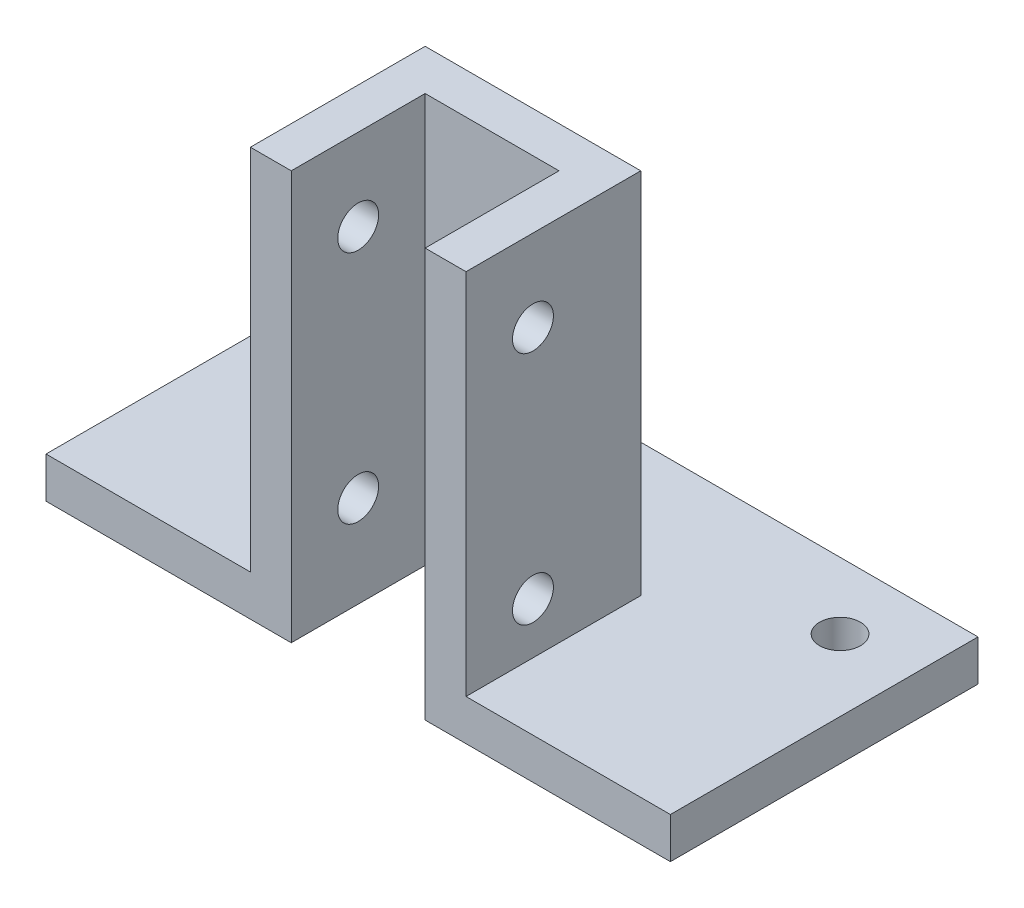
ISO-10303-21;
HEADER;
FILE_DESCRIPTION(('STEP AP214'),'2;1');
FILE_NAME('part.step','',(''),(''),'','','');
FILE_SCHEMA(('AUTOMOTIVE_DESIGN { 1 0 10303 214 1 1 1 1 }'));
ENDSEC;
DATA;
#1=APPLICATION_CONTEXT('core data for automotive mechanical design processes');
#2=APPLICATION_PROTOCOL_DEFINITION('international standard','automotive_design',2000,#1);
#3=PRODUCT_CONTEXT('',#1,'mechanical');
#4=PRODUCT('Part','Part','',(#3));
#5=PRODUCT_RELATED_PRODUCT_CATEGORY('part','',(#4));
#6=PRODUCT_DEFINITION_FORMATION('','',#4);
#7=PRODUCT_DEFINITION_CONTEXT('part definition',#1,'design');
#8=PRODUCT_DEFINITION('design','',#6,#7);
#9=PRODUCT_DEFINITION_SHAPE('','',#8);
#10=(LENGTH_UNIT() NAMED_UNIT(*) SI_UNIT(.MILLI.,.METRE.));
#11=(NAMED_UNIT(*) PLANE_ANGLE_UNIT() SI_UNIT($,.RADIAN.));
#12=(NAMED_UNIT(*) SI_UNIT($,.STERADIAN.) SOLID_ANGLE_UNIT());
#13=UNCERTAINTY_MEASURE_WITH_UNIT(LENGTH_MEASURE(1.E-05),#10,'distance_accuracy_value','');
#14=(GEOMETRIC_REPRESENTATION_CONTEXT(3) GLOBAL_UNCERTAINTY_ASSIGNED_CONTEXT((#13)) GLOBAL_UNIT_ASSIGNED_CONTEXT((#10,
#11,#12)) REPRESENTATION_CONTEXT('',''));
#15=CARTESIAN_POINT('',(0.,0.,0.));
#16=DIRECTION('',(0.,0.,1.));
#17=DIRECTION('',(1.,0.,0.));
#18=AXIS2_PLACEMENT_3D('',#15,#16,#17);
#19=CARTESIAN_POINT('',(0.,40.,-2.));
#20=DIRECTION('',(0.,0.,1.));
#21=DIRECTION('',(1.,0.,0.));
#22=AXIS2_PLACEMENT_3D('',#19,#20,#21);
#23=PLANE('',#22);
#24=DIRECTION('',(1.,0.,0.));
#25=VECTOR('',#24,1.);
#26=CARTESIAN_POINT('',(0.,4.,-2.));
#27=LINE('',#26,#25);
#28=CARTESIAN_POINT('',(-10.55,4.,-2.));
#29=VERTEX_POINT('',#28);
#30=CARTESIAN_POINT('',(10.55,4.,-2.));
#31=VERTEX_POINT('',#30);
#32=EDGE_CURVE('E196',#29,#31,#27,.T.);
#33=ORIENTED_EDGE('',*,*,#32,.F.);
#34=DIRECTION('',(0.,-1.,0.));
#35=VECTOR('',#34,1.);
#36=CARTESIAN_POINT('',(-10.55,40.,-2.));
#37=LINE('',#36,#35);
#38=CARTESIAN_POINT('',(-10.55,40.,-2.));
#39=VERTEX_POINT('',#38);
#40=EDGE_CURVE('E11',#39,#29,#37,.T.);
#41=ORIENTED_EDGE('',*,*,#40,.F.);
#42=DIRECTION('',(-1.,0.,0.));
#43=VECTOR('',#42,1.);
#44=CARTESIAN_POINT('',(0.,40.,-2.));
#45=LINE('',#44,#43);
#46=CARTESIAN_POINT('',(10.55,40.,-2.));
#47=VERTEX_POINT('',#46);
#48=EDGE_CURVE('E139',#47,#39,#45,.T.);
#49=ORIENTED_EDGE('',*,*,#48,.F.);
#50=DIRECTION('',(0.,-1.,0.));
#51=VECTOR('',#50,1.);
#52=CARTESIAN_POINT('',(10.55,40.,-2.));
#53=LINE('',#52,#51);
#54=EDGE_CURVE('E51',#47,#31,#53,.T.);
#55=ORIENTED_EDGE('',*,*,#54,.T.);
#56=EDGE_LOOP('',(#33,#41,#49,#55));
#57=FACE_BOUND('',#56,.T.);
#58=ADVANCED_FACE('F33',(#57),#23,.F.);
#59=CARTESIAN_POINT('',(-10.55,40.,0.));
#60=DIRECTION('',(1.,0.,0.));
#61=DIRECTION('',(0.,0.,-1.));
#62=AXIS2_PLACEMENT_3D('',#59,#60,#61);
#63=PLANE('',#62);
#64=CARTESIAN_POINT('',(-10.55,32.,8.55));
#65=DIRECTION('',(-1.,0.,0.));
#66=DIRECTION('',(0.,0.,1.));
#67=AXIS2_PLACEMENT_3D('',#64,#65,#66);
#68=CIRCLE('',#67,2.);
#69=CARTESIAN_POINT('',(-10.55,32.,10.55));
#70=VERTEX_POINT('',#69);
#71=EDGE_CURVE('E151',#70,#70,#68,.T.);
#72=ORIENTED_EDGE('',*,*,#71,.F.);
#73=EDGE_LOOP('',(#72));
#74=FACE_BOUND('',#73,.T.);
#75=CARTESIAN_POINT('',(-10.55,9.,8.55));
#76=DIRECTION('',(-1.,0.,0.));
#77=DIRECTION('',(0.,0.,1.));
#78=AXIS2_PLACEMENT_3D('',#75,#76,#77);
#79=CIRCLE('',#78,2.);
#80=CARTESIAN_POINT('',(-10.55,9.,10.55));
#81=VERTEX_POINT('',#80);
#82=EDGE_CURVE('E158',#81,#81,#79,.T.);
#83=ORIENTED_EDGE('',*,*,#82,.F.);
#84=EDGE_LOOP('',(#83));
#85=FACE_BOUND('',#84,.T.);
#86=DIRECTION('',(0.,0.,-1.));
#87=VECTOR('',#86,1.);
#88=CARTESIAN_POINT('',(-10.55,4.,0.));
#89=LINE('',#88,#87);
#90=CARTESIAN_POINT('',(-10.55,4.,15.1));
#91=VERTEX_POINT('',#90);
#92=EDGE_CURVE('E199',#91,#29,#89,.T.);
#93=ORIENTED_EDGE('',*,*,#92,.F.);
#94=DIRECTION('',(0.,-1.,0.));
#95=VECTOR('',#94,1.);
#96=CARTESIAN_POINT('',(-10.55,40.,15.1));
#97=LINE('',#96,#95);
#98=CARTESIAN_POINT('',(-10.55,40.,15.1));
#99=VERTEX_POINT('',#98);
#100=EDGE_CURVE('E42',#99,#91,#97,.T.);
#101=ORIENTED_EDGE('',*,*,#100,.F.);
#102=DIRECTION('',(0.,0.,1.));
#103=VECTOR('',#102,1.);
#104=CARTESIAN_POINT('',(-10.55,40.,0.));
#105=LINE('',#104,#103);
#106=EDGE_CURVE('E86',#39,#99,#105,.T.);
#107=ORIENTED_EDGE('',*,*,#106,.F.);
#108=ORIENTED_EDGE('',*,*,#40,.T.);
#109=EDGE_LOOP('',(#93,#101,#107,#108));
#110=FACE_BOUND('',#109,.T.);
#111=ADVANCED_FACE('F261',(#74,#85,#110),#63,.F.);
#112=CARTESIAN_POINT('',(10.55,40.,0.));
#113=DIRECTION('',(1.,0.,0.));
#114=DIRECTION('',(0.,0.,-1.));
#115=AXIS2_PLACEMENT_3D('',#112,#113,#114);
#116=PLANE('',#115);
#117=CARTESIAN_POINT('',(10.55,32.,8.55));
#118=DIRECTION('',(1.,0.,0.));
#119=DIRECTION('',(0.,0.,-1.));
#120=AXIS2_PLACEMENT_3D('',#117,#118,#119);
#121=CIRCLE('',#120,2.);
#122=CARTESIAN_POINT('',(10.55,32.,6.55));
#123=VERTEX_POINT('',#122);
#124=EDGE_CURVE('E170',#123,#123,#121,.T.);
#125=ORIENTED_EDGE('',*,*,#124,.F.);
#126=EDGE_LOOP('',(#125));
#127=FACE_BOUND('',#126,.T.);
#128=CARTESIAN_POINT('',(10.55,9.,8.55));
#129=DIRECTION('',(1.,0.,0.));
#130=DIRECTION('',(0.,0.,-1.));
#131=AXIS2_PLACEMENT_3D('',#128,#129,#130);
#132=CIRCLE('',#131,2.);
#133=CARTESIAN_POINT('',(10.55,9.,6.55));
#134=VERTEX_POINT('',#133);
#135=EDGE_CURVE('E155',#134,#134,#132,.T.);
#136=ORIENTED_EDGE('',*,*,#135,.F.);
#137=EDGE_LOOP('',(#136));
#138=FACE_BOUND('',#137,.T.);
#139=DIRECTION('',(0.,-1.,0.));
#140=VECTOR('',#139,1.);
#141=CARTESIAN_POINT('',(10.55,40.,15.1));
#142=LINE('',#141,#140);
#143=CARTESIAN_POINT('',(10.55,40.,15.1));
#144=VERTEX_POINT('',#143);
#145=CARTESIAN_POINT('',(10.55,4.,15.1));
#146=VERTEX_POINT('',#145);
#147=EDGE_CURVE('E106',#144,#146,#142,.T.);
#148=ORIENTED_EDGE('',*,*,#147,.T.);
#149=DIRECTION('',(0.,0.,1.));
#150=VECTOR('',#149,1.);
#151=CARTESIAN_POINT('',(10.55,4.,0.));
#152=LINE('',#151,#150);
#153=EDGE_CURVE('E193',#31,#146,#152,.T.);
#154=ORIENTED_EDGE('',*,*,#153,.F.);
#155=ORIENTED_EDGE('',*,*,#54,.F.);
#156=DIRECTION('',(0.,0.,1.));
#157=VECTOR('',#156,1.);
#158=CARTESIAN_POINT('',(10.55,40.,0.));
#159=LINE('',#158,#157);
#160=EDGE_CURVE('E115',#47,#144,#159,.T.);
#161=ORIENTED_EDGE('',*,*,#160,.T.);
#162=EDGE_LOOP('',(#148,#154,#155,#161));
#163=FACE_BOUND('',#162,.T.);
#164=ADVANCED_FACE('F266',(#127,#138,#163),#116,.T.);
#165=CARTESIAN_POINT('',(0.,40.,15.1));
#166=DIRECTION('',(0.,0.,1.));
#167=DIRECTION('',(1.,0.,0.));
#168=AXIS2_PLACEMENT_3D('',#165,#166,#167);
#169=PLANE('',#168);
#170=DIRECTION('',(-1.,0.,0.));
#171=VECTOR('',#170,1.);
#172=CARTESIAN_POINT('',(0.,0.,15.1));
#173=LINE('',#172,#171);
#174=CARTESIAN_POINT('',(-6.55,0.,15.1));
#175=VERTEX_POINT('',#174);
#176=CARTESIAN_POINT('',(-30.55,0.,15.1));
#177=VERTEX_POINT('',#176);
#178=EDGE_CURVE('E127',#175,#177,#173,.T.);
#179=ORIENTED_EDGE('',*,*,#178,.F.);
#180=DIRECTION('',(0.,-1.,0.));
#181=VECTOR('',#180,1.);
#182=CARTESIAN_POINT('',(-6.55,40.,15.1));
#183=LINE('',#182,#181);
#184=CARTESIAN_POINT('',(-6.55,40.,15.1));
#185=VERTEX_POINT('',#184);
#186=EDGE_CURVE('E145',#185,#175,#183,.T.);
#187=ORIENTED_EDGE('',*,*,#186,.F.);
#188=DIRECTION('',(-1.,0.,0.));
#189=VECTOR('',#188,1.);
#190=CARTESIAN_POINT('',(0.,40.,15.1));
#191=LINE('',#190,#189);
#192=EDGE_CURVE('E231',#185,#99,#191,.T.);
#193=ORIENTED_EDGE('',*,*,#192,.T.);
#194=ORIENTED_EDGE('',*,*,#100,.T.);
#195=DIRECTION('',(-1.,0.,0.));
#196=VECTOR('',#195,1.);
#197=CARTESIAN_POINT('',(0.,4.,15.1));
#198=LINE('',#197,#196);
#199=CARTESIAN_POINT('',(-30.55,4.,15.1));
#200=VERTEX_POINT('',#199);
#201=EDGE_CURVE('E202',#91,#200,#198,.T.);
#202=ORIENTED_EDGE('',*,*,#201,.T.);
#203=DIRECTION('',(0.,-1.,0.));
#204=VECTOR('',#203,1.);
#205=CARTESIAN_POINT('',(-30.55,4.,15.1));
#206=LINE('',#205,#204);
#207=EDGE_CURVE('E224',#200,#177,#206,.T.);
#208=ORIENTED_EDGE('',*,*,#207,.T.);
#209=EDGE_LOOP('',(#179,#187,#193,#194,#202,#208));
#210=FACE_BOUND('',#209,.T.);
#211=ADVANCED_FACE('F240',(#210),#169,.T.);
#212=CARTESIAN_POINT('',(-6.55,40.,0.));
#213=DIRECTION('',(1.,0.,0.));
#214=DIRECTION('',(0.,0.,-1.));
#215=AXIS2_PLACEMENT_3D('',#212,#213,#214);
#216=PLANE('',#215);
#217=CARTESIAN_POINT('',(-6.55,32.,8.55));
#218=DIRECTION('',(1.,0.,0.));
#219=DIRECTION('',(0.,0.,-1.));
#220=AXIS2_PLACEMENT_3D('',#217,#218,#219);
#221=CIRCLE('',#220,2.);
#222=CARTESIAN_POINT('',(-6.55,32.,6.55));
#223=VERTEX_POINT('',#222);
#224=EDGE_CURVE('E167',#223,#223,#221,.T.);
#225=ORIENTED_EDGE('',*,*,#224,.F.);
#226=EDGE_LOOP('',(#225));
#227=FACE_BOUND('',#226,.T.);
#228=CARTESIAN_POINT('',(-6.55,9.,8.55));
#229=DIRECTION('',(1.,0.,0.));
#230=DIRECTION('',(0.,0.,-1.));
#231=AXIS2_PLACEMENT_3D('',#228,#229,#230);
#232=CIRCLE('',#231,2.);
#233=CARTESIAN_POINT('',(-6.55,9.,6.55));
#234=VERTEX_POINT('',#233);
#235=EDGE_CURVE('E150',#234,#234,#232,.T.);
#236=ORIENTED_EDGE('',*,*,#235,.F.);
#237=EDGE_LOOP('',(#236));
#238=FACE_BOUND('',#237,.T.);
#239=DIRECTION('',(0.,0.,1.));
#240=VECTOR('',#239,1.);
#241=CARTESIAN_POINT('',(-6.55,0.,0.));
#242=LINE('',#241,#240);
#243=CARTESIAN_POINT('',(-6.55,0.,2.));
#244=VERTEX_POINT('',#243);
#245=EDGE_CURVE('E130',#244,#175,#242,.T.);
#246=ORIENTED_EDGE('',*,*,#245,.F.);
#247=DIRECTION('',(0.,-1.,0.));
#248=VECTOR('',#247,1.);
#249=CARTESIAN_POINT('',(-6.55,40.,2.));
#250=LINE('',#249,#248);
#251=CARTESIAN_POINT('',(-6.55,40.,2.));
#252=VERTEX_POINT('',#251);
#253=EDGE_CURVE('E143',#252,#244,#250,.T.);
#254=ORIENTED_EDGE('',*,*,#253,.F.);
#255=DIRECTION('',(0.,0.,1.));
#256=VECTOR('',#255,1.);
#257=CARTESIAN_POINT('',(-6.55,40.,0.));
#258=LINE('',#257,#256);
#259=EDGE_CURVE('E122',#252,#185,#258,.T.);
#260=ORIENTED_EDGE('',*,*,#259,.T.);
#261=ORIENTED_EDGE('',*,*,#186,.T.);
#262=EDGE_LOOP('',(#246,#254,#260,#261));
#263=FACE_BOUND('',#262,.T.);
#264=ADVANCED_FACE('F236',(#227,#238,#263),#216,.T.);
#265=CARTESIAN_POINT('',(0.,40.,2.));
#266=DIRECTION('',(0.,0.,-1.));
#267=DIRECTION('',(-1.,0.,0.));
#268=AXIS2_PLACEMENT_3D('',#265,#266,#267);
#269=PLANE('',#268);
#270=DIRECTION('',(1.,0.,0.));
#271=VECTOR('',#270,1.);
#272=CARTESIAN_POINT('',(0.,0.,2.));
#273=LINE('',#272,#271);
#274=CARTESIAN_POINT('',(6.55,0.,2.));
#275=VERTEX_POINT('',#274);
#276=EDGE_CURVE('E134',#244,#275,#273,.T.);
#277=ORIENTED_EDGE('',*,*,#276,.T.);
#278=DIRECTION('',(0.,-1.,0.));
#279=VECTOR('',#278,1.);
#280=CARTESIAN_POINT('',(6.55,40.,2.));
#281=LINE('',#280,#279);
#282=CARTESIAN_POINT('',(6.55,40.,2.));
#283=VERTEX_POINT('',#282);
#284=EDGE_CURVE('E70',#283,#275,#281,.T.);
#285=ORIENTED_EDGE('',*,*,#284,.F.);
#286=DIRECTION('',(1.,0.,0.));
#287=VECTOR('',#286,1.);
#288=CARTESIAN_POINT('',(0.,40.,2.));
#289=LINE('',#288,#287);
#290=EDGE_CURVE('E120',#252,#283,#289,.T.);
#291=ORIENTED_EDGE('',*,*,#290,.F.);
#292=ORIENTED_EDGE('',*,*,#253,.T.);
#293=EDGE_LOOP('',(#277,#285,#291,#292));
#294=FACE_BOUND('',#293,.T.);
#295=ADVANCED_FACE('F249',(#294),#269,.F.);
#296=CARTESIAN_POINT('',(6.55,40.,0.));
#297=DIRECTION('',(-1.,0.,0.));
#298=DIRECTION('',(0.,0.,1.));
#299=AXIS2_PLACEMENT_3D('',#296,#297,#298);
#300=PLANE('',#299);
#301=CARTESIAN_POINT('',(6.55,32.,8.55));
#302=DIRECTION('',(-1.,0.,0.));
#303=DIRECTION('',(0.,0.,1.));
#304=AXIS2_PLACEMENT_3D('',#301,#302,#303);
#305=CIRCLE('',#304,2.);
#306=CARTESIAN_POINT('',(6.55,32.,10.55));
#307=VERTEX_POINT('',#306);
#308=EDGE_CURVE('E36',#307,#307,#305,.T.);
#309=ORIENTED_EDGE('',*,*,#308,.F.);
#310=EDGE_LOOP('',(#309));
#311=FACE_BOUND('',#310,.T.);
#312=CARTESIAN_POINT('',(6.55,9.,8.55));
#313=DIRECTION('',(-1.,0.,0.));
#314=DIRECTION('',(0.,0.,1.));
#315=AXIS2_PLACEMENT_3D('',#312,#313,#314);
#316=CIRCLE('',#315,2.);
#317=CARTESIAN_POINT('',(6.55,9.,10.55));
#318=VERTEX_POINT('',#317);
#319=EDGE_CURVE('E148',#318,#318,#316,.T.);
#320=ORIENTED_EDGE('',*,*,#319,.F.);
#321=EDGE_LOOP('',(#320));
#322=FACE_BOUND('',#321,.T.);
#323=DIRECTION('',(0.,0.,-1.));
#324=VECTOR('',#323,1.);
#325=CARTESIAN_POINT('',(6.55,0.,0.));
#326=LINE('',#325,#324);
#327=CARTESIAN_POINT('',(6.55,0.,15.1));
#328=VERTEX_POINT('',#327);
#329=EDGE_CURVE('E105',#328,#275,#326,.T.);
#330=ORIENTED_EDGE('',*,*,#329,.F.);
#331=DIRECTION('',(0.,-1.,0.));
#332=VECTOR('',#331,1.);
#333=CARTESIAN_POINT('',(6.55,40.,15.1));
#334=LINE('',#333,#332);
#335=CARTESIAN_POINT('',(6.55,40.,15.1));
#336=VERTEX_POINT('',#335);
#337=EDGE_CURVE('E78',#336,#328,#334,.T.);
#338=ORIENTED_EDGE('',*,*,#337,.F.);
#339=DIRECTION('',(0.,0.,-1.));
#340=VECTOR('',#339,1.);
#341=CARTESIAN_POINT('',(6.55,40.,0.));
#342=LINE('',#341,#340);
#343=EDGE_CURVE('E103',#336,#283,#342,.T.);
#344=ORIENTED_EDGE('',*,*,#343,.T.);
#345=ORIENTED_EDGE('',*,*,#284,.T.);
#346=EDGE_LOOP('',(#330,#338,#344,#345));
#347=FACE_BOUND('',#346,.T.);
#348=ADVANCED_FACE('F101',(#311,#322,#347),#300,.T.);
#349=CARTESIAN_POINT('',(0.,40.,15.1));
#350=DIRECTION('',(0.,0.,-1.));
#351=DIRECTION('',(-1.,0.,0.));
#352=AXIS2_PLACEMENT_3D('',#349,#350,#351);
#353=PLANE('',#352);
#354=DIRECTION('',(1.,0.,0.));
#355=VECTOR('',#354,1.);
#356=CARTESIAN_POINT('',(0.,0.,15.1));
#357=LINE('',#356,#355);
#358=CARTESIAN_POINT('',(30.55,0.,15.1));
#359=VERTEX_POINT('',#358);
#360=EDGE_CURVE('E137',#328,#359,#357,.T.);
#361=ORIENTED_EDGE('',*,*,#360,.T.);
#362=DIRECTION('',(0.,-1.,0.));
#363=VECTOR('',#362,1.);
#364=CARTESIAN_POINT('',(30.55,4.,15.1));
#365=LINE('',#364,#363);
#366=CARTESIAN_POINT('',(30.55,4.,15.1));
#367=VERTEX_POINT('',#366);
#368=EDGE_CURVE('E211',#367,#359,#365,.T.);
#369=ORIENTED_EDGE('',*,*,#368,.F.);
#370=DIRECTION('',(1.,0.,0.));
#371=VECTOR('',#370,1.);
#372=CARTESIAN_POINT('',(0.,4.,15.1));
#373=LINE('',#372,#371);
#374=EDGE_CURVE('E189',#146,#367,#373,.T.);
#375=ORIENTED_EDGE('',*,*,#374,.F.);
#376=ORIENTED_EDGE('',*,*,#147,.F.);
#377=DIRECTION('',(1.,0.,0.));
#378=VECTOR('',#377,1.);
#379=CARTESIAN_POINT('',(0.,40.,15.1));
#380=LINE('',#379,#378);
#381=EDGE_CURVE('E109',#336,#144,#380,.T.);
#382=ORIENTED_EDGE('',*,*,#381,.F.);
#383=ORIENTED_EDGE('',*,*,#337,.T.);
#384=EDGE_LOOP('',(#361,#369,#375,#376,#382,#383));
#385=FACE_BOUND('',#384,.T.);
#386=ADVANCED_FACE('F110',(#385),#353,.F.);
#387=CARTESIAN_POINT('',(0.,40.,0.));
#388=DIRECTION('',(0.,1.,0.));
#389=DIRECTION('',(0.,0.,1.));
#390=AXIS2_PLACEMENT_3D('',#387,#388,#389);
#391=PLANE('',#390);
#392=ORIENTED_EDGE('',*,*,#48,.T.);
#393=ORIENTED_EDGE('',*,*,#106,.T.);
#394=ORIENTED_EDGE('',*,*,#192,.F.);
#395=ORIENTED_EDGE('',*,*,#259,.F.);
#396=ORIENTED_EDGE('',*,*,#290,.T.);
#397=ORIENTED_EDGE('',*,*,#343,.F.);
#398=ORIENTED_EDGE('',*,*,#381,.T.);
#399=ORIENTED_EDGE('',*,*,#160,.F.);
#400=EDGE_LOOP('',(#392,#393,#394,#395,#396,#397,#398,#399));
#401=FACE_BOUND('',#400,.T.);
#402=ADVANCED_FACE('F117',(#401),#391,.T.);
#403=CARTESIAN_POINT('',(0.,0.,0.));
#404=DIRECTION('',(0.,1.,0.));
#405=DIRECTION('',(0.,0.,1.));
#406=AXIS2_PLACEMENT_3D('',#403,#404,#405);
#407=PLANE('',#406);
#408=CARTESIAN_POINT('',(-23.55,0.,-8.5));
#409=DIRECTION('',(0.,1.,0.));
#410=DIRECTION('',(0.,0.,1.));
#411=AXIS2_PLACEMENT_3D('',#408,#409,#410);
#412=CIRCLE('',#411,2.);
#413=CARTESIAN_POINT('',(-23.55,0.,-6.49999999999999));
#414=VERTEX_POINT('',#413);
#415=EDGE_CURVE('E174',#414,#414,#412,.T.);
#416=ORIENTED_EDGE('',*,*,#415,.T.);
#417=EDGE_LOOP('',(#416));
#418=FACE_BOUND('',#417,.T.);
#419=CARTESIAN_POINT('',(23.55,0.,-8.5));
#420=DIRECTION('',(0.,1.,0.));
#421=DIRECTION('',(0.,0.,1.));
#422=AXIS2_PLACEMENT_3D('',#419,#420,#421);
#423=CIRCLE('',#422,2.);
#424=CARTESIAN_POINT('',(23.55,0.,-6.5));
#425=VERTEX_POINT('',#424);
#426=EDGE_CURVE('E181',#425,#425,#423,.T.);
#427=ORIENTED_EDGE('',*,*,#426,.T.);
#428=EDGE_LOOP('',(#427));
#429=FACE_BOUND('',#428,.T.);
#430=ORIENTED_EDGE('',*,*,#178,.T.);
#431=DIRECTION('',(0.,0.,-1.));
#432=VECTOR('',#431,1.);
#433=CARTESIAN_POINT('',(-30.55,0.,0.));
#434=LINE('',#433,#432);
#435=CARTESIAN_POINT('',(-30.55,0.,-15.));
#436=VERTEX_POINT('',#435);
#437=EDGE_CURVE('E214',#177,#436,#434,.T.);
#438=ORIENTED_EDGE('',*,*,#437,.T.);
#439=DIRECTION('',(1.,0.,0.));
#440=VECTOR('',#439,1.);
#441=CARTESIAN_POINT('',(0.,0.,-15.));
#442=LINE('',#441,#440);
#443=CARTESIAN_POINT('',(30.55,0.,-15.));
#444=VERTEX_POINT('',#443);
#445=EDGE_CURVE('E190',#436,#444,#442,.T.);
#446=ORIENTED_EDGE('',*,*,#445,.T.);
#447=DIRECTION('',(0.,0.,-1.));
#448=VECTOR('',#447,1.);
#449=CARTESIAN_POINT('',(30.55,0.,0.));
#450=LINE('',#449,#448);
#451=EDGE_CURVE('E177',#359,#444,#450,.T.);
#452=ORIENTED_EDGE('',*,*,#451,.F.);
#453=ORIENTED_EDGE('',*,*,#360,.F.);
#454=ORIENTED_EDGE('',*,*,#329,.T.);
#455=ORIENTED_EDGE('',*,*,#276,.F.);
#456=ORIENTED_EDGE('',*,*,#245,.T.);
#457=EDGE_LOOP('',(#430,#438,#446,#452,#453,#454,#455,#456));
#458=FACE_BOUND('',#457,.T.);
#459=ADVANCED_FACE('F247',(#418,#429,#458),#407,.F.);
#460=CARTESIAN_POINT('',(30.55,4.,0.));
#461=DIRECTION('',(-1.,0.,0.));
#462=DIRECTION('',(0.,0.,1.));
#463=AXIS2_PLACEMENT_3D('',#460,#461,#462);
#464=PLANE('',#463);
#465=ORIENTED_EDGE('',*,*,#451,.T.);
#466=DIRECTION('',(0.,-1.,0.));
#467=VECTOR('',#466,1.);
#468=CARTESIAN_POINT('',(30.55,4.,-15.));
#469=LINE('',#468,#467);
#470=CARTESIAN_POINT('',(30.55,4.,-15.));
#471=VERTEX_POINT('',#470);
#472=EDGE_CURVE('E131',#471,#444,#469,.T.);
#473=ORIENTED_EDGE('',*,*,#472,.F.);
#474=DIRECTION('',(0.,0.,-1.));
#475=VECTOR('',#474,1.);
#476=CARTESIAN_POINT('',(30.55,4.,0.));
#477=LINE('',#476,#475);
#478=EDGE_CURVE('E186',#367,#471,#477,.T.);
#479=ORIENTED_EDGE('',*,*,#478,.F.);
#480=ORIENTED_EDGE('',*,*,#368,.T.);
#481=EDGE_LOOP('',(#465,#473,#479,#480));
#482=FACE_BOUND('',#481,.T.);
#483=ADVANCED_FACE('F320',(#482),#464,.F.);
#484=CARTESIAN_POINT('',(0.,4.,-15.));
#485=DIRECTION('',(0.,0.,-1.));
#486=DIRECTION('',(-1.,0.,0.));
#487=AXIS2_PLACEMENT_3D('',#484,#485,#486);
#488=PLANE('',#487);
#489=ORIENTED_EDGE('',*,*,#445,.F.);
#490=DIRECTION('',(0.,-1.,0.));
#491=VECTOR('',#490,1.);
#492=CARTESIAN_POINT('',(-30.55,4.,-15.));
#493=LINE('',#492,#491);
#494=CARTESIAN_POINT('',(-30.55,4.,-15.));
#495=VERTEX_POINT('',#494);
#496=EDGE_CURVE('E221',#495,#436,#493,.T.);
#497=ORIENTED_EDGE('',*,*,#496,.F.);
#498=DIRECTION('',(1.,0.,0.));
#499=VECTOR('',#498,1.);
#500=CARTESIAN_POINT('',(0.,4.,-15.));
#501=LINE('',#500,#499);
#502=EDGE_CURVE('E208',#495,#471,#501,.T.);
#503=ORIENTED_EDGE('',*,*,#502,.T.);
#504=ORIENTED_EDGE('',*,*,#472,.T.);
#505=EDGE_LOOP('',(#489,#497,#503,#504));
#506=FACE_BOUND('',#505,.T.);
#507=ADVANCED_FACE('F325',(#506),#488,.T.);
#508=CARTESIAN_POINT('',(-30.55,4.,0.));
#509=DIRECTION('',(-1.,0.,0.));
#510=DIRECTION('',(0.,0.,1.));
#511=AXIS2_PLACEMENT_3D('',#508,#509,#510);
#512=PLANE('',#511);
#513=ORIENTED_EDGE('',*,*,#437,.F.);
#514=ORIENTED_EDGE('',*,*,#207,.F.);
#515=DIRECTION('',(0.,0.,-1.));
#516=VECTOR('',#515,1.);
#517=CARTESIAN_POINT('',(-30.55,4.,0.));
#518=LINE('',#517,#516);
#519=EDGE_CURVE('E205',#200,#495,#518,.T.);
#520=ORIENTED_EDGE('',*,*,#519,.T.);
#521=ORIENTED_EDGE('',*,*,#496,.T.);
#522=EDGE_LOOP('',(#513,#514,#520,#521));
#523=FACE_BOUND('',#522,.T.);
#524=ADVANCED_FACE('F327',(#523),#512,.T.);
#525=CARTESIAN_POINT('',(0.,4.,0.));
#526=DIRECTION('',(0.,-1.,0.));
#527=DIRECTION('',(0.,0.,-1.));
#528=AXIS2_PLACEMENT_3D('',#525,#526,#527);
#529=PLANE('',#528);
#530=CARTESIAN_POINT('',(-23.55,4.,-8.5));
#531=DIRECTION('',(0.,1.,0.));
#532=DIRECTION('',(0.,0.,1.));
#533=AXIS2_PLACEMENT_3D('',#530,#531,#532);
#534=CIRCLE('',#533,2.);
#535=CARTESIAN_POINT('',(-23.55,4.,-6.49999999999999));
#536=VERTEX_POINT('',#535);
#537=EDGE_CURVE('E178',#536,#536,#534,.T.);
#538=ORIENTED_EDGE('',*,*,#537,.F.);
#539=EDGE_LOOP('',(#538));
#540=FACE_BOUND('',#539,.T.);
#541=CARTESIAN_POINT('',(23.55,4.,-8.5));
#542=DIRECTION('',(0.,1.,0.));
#543=DIRECTION('',(0.,0.,1.));
#544=AXIS2_PLACEMENT_3D('',#541,#542,#543);
#545=CIRCLE('',#544,2.);
#546=CARTESIAN_POINT('',(23.55,4.,-6.5));
#547=VERTEX_POINT('',#546);
#548=EDGE_CURVE('E173',#547,#547,#545,.T.);
#549=ORIENTED_EDGE('',*,*,#548,.F.);
#550=EDGE_LOOP('',(#549));
#551=FACE_BOUND('',#550,.T.);
#552=ORIENTED_EDGE('',*,*,#478,.T.);
#553=ORIENTED_EDGE('',*,*,#502,.F.);
#554=ORIENTED_EDGE('',*,*,#519,.F.);
#555=ORIENTED_EDGE('',*,*,#201,.F.);
#556=ORIENTED_EDGE('',*,*,#92,.T.);
#557=ORIENTED_EDGE('',*,*,#32,.T.);
#558=ORIENTED_EDGE('',*,*,#153,.T.);
#559=ORIENTED_EDGE('',*,*,#374,.T.);
#560=EDGE_LOOP('',(#552,#553,#554,#555,#556,#557,#558,#559));
#561=FACE_BOUND('',#560,.T.);
#562=ADVANCED_FACE('F278',(#540,#551,#561),#529,.F.);
#563=CARTESIAN_POINT('',(23.55,0.,-8.5));
#564=DIRECTION('',(0.,1.,0.));
#565=DIRECTION('',(0.,0.,1.));
#566=AXIS2_PLACEMENT_3D('',#563,#564,#565);
#567=CYLINDRICAL_SURFACE('',#566,2.);
#568=ORIENTED_EDGE('',*,*,#426,.F.);
#569=EDGE_LOOP('',(#568));
#570=FACE_BOUND('',#569,.T.);
#571=ORIENTED_EDGE('',*,*,#548,.T.);
#572=EDGE_LOOP('',(#571));
#573=FACE_BOUND('',#572,.T.);
#574=ADVANCED_FACE('F334',(#570,#573),#567,.F.);
#575=CARTESIAN_POINT('',(-23.55,0.,-8.5));
#576=DIRECTION('',(0.,1.,0.));
#577=DIRECTION('',(0.,0.,1.));
#578=AXIS2_PLACEMENT_3D('',#575,#576,#577);
#579=CYLINDRICAL_SURFACE('',#578,2.);
#580=ORIENTED_EDGE('',*,*,#415,.F.);
#581=EDGE_LOOP('',(#580));
#582=FACE_BOUND('',#581,.T.);
#583=ORIENTED_EDGE('',*,*,#537,.T.);
#584=EDGE_LOOP('',(#583));
#585=FACE_BOUND('',#584,.T.);
#586=ADVANCED_FACE('F338',(#582,#585),#579,.F.);
#587=CARTESIAN_POINT('',(30.55,9.,8.55));
#588=DIRECTION('',(-1.,0.,0.));
#589=DIRECTION('',(0.,0.,1.));
#590=AXIS2_PLACEMENT_3D('',#587,#588,#589);
#591=CYLINDRICAL_SURFACE('',#590,2.);
#592=ORIENTED_EDGE('',*,*,#135,.T.);
#593=EDGE_LOOP('',(#592));
#594=FACE_BOUND('',#593,.T.);
#595=ORIENTED_EDGE('',*,*,#319,.T.);
#596=EDGE_LOOP('',(#595));
#597=FACE_BOUND('',#596,.T.);
#598=ADVANCED_FACE('F342',(#594,#597),#591,.F.);
#599=CARTESIAN_POINT('',(30.55,32.,8.55));
#600=DIRECTION('',(-1.,0.,0.));
#601=DIRECTION('',(0.,0.,1.));
#602=AXIS2_PLACEMENT_3D('',#599,#600,#601);
#603=CYLINDRICAL_SURFACE('',#602,2.);
#604=ORIENTED_EDGE('',*,*,#124,.T.);
#605=EDGE_LOOP('',(#604));
#606=FACE_BOUND('',#605,.T.);
#607=ORIENTED_EDGE('',*,*,#308,.T.);
#608=EDGE_LOOP('',(#607));
#609=FACE_BOUND('',#608,.T.);
#610=ADVANCED_FACE('F346',(#606,#609),#603,.F.);
#611=ORIENTED_EDGE('',*,*,#235,.T.);
#612=EDGE_LOOP('',(#611));
#613=FACE_BOUND('',#612,.T.);
#614=ORIENTED_EDGE('',*,*,#82,.T.);
#615=EDGE_LOOP('',(#614));
#616=FACE_BOUND('',#615,.T.);
#617=ADVANCED_FACE('F348',(#613,#616),#591,.F.);
#618=ORIENTED_EDGE('',*,*,#224,.T.);
#619=EDGE_LOOP('',(#618));
#620=FACE_BOUND('',#619,.T.);
#621=ORIENTED_EDGE('',*,*,#71,.T.);
#622=EDGE_LOOP('',(#621));
#623=FACE_BOUND('',#622,.T.);
#624=ADVANCED_FACE('F351',(#620,#623),#603,.F.);
#625=CLOSED_SHELL('',(#58,#111,#164,#211,#264,#295,#348,#386,#402,#459,#483,#507,#524,#562,#574,
#586,#598,#610,#617,#624));
#626=MANIFOLD_SOLID_BREP('B2',#625);
#627=ADVANCED_BREP_SHAPE_REPRESENTATION('',(#18,#626),#14);
#628=SHAPE_DEFINITION_REPRESENTATION(#9,#627);
ENDSEC;
END-ISO-10303-21;
